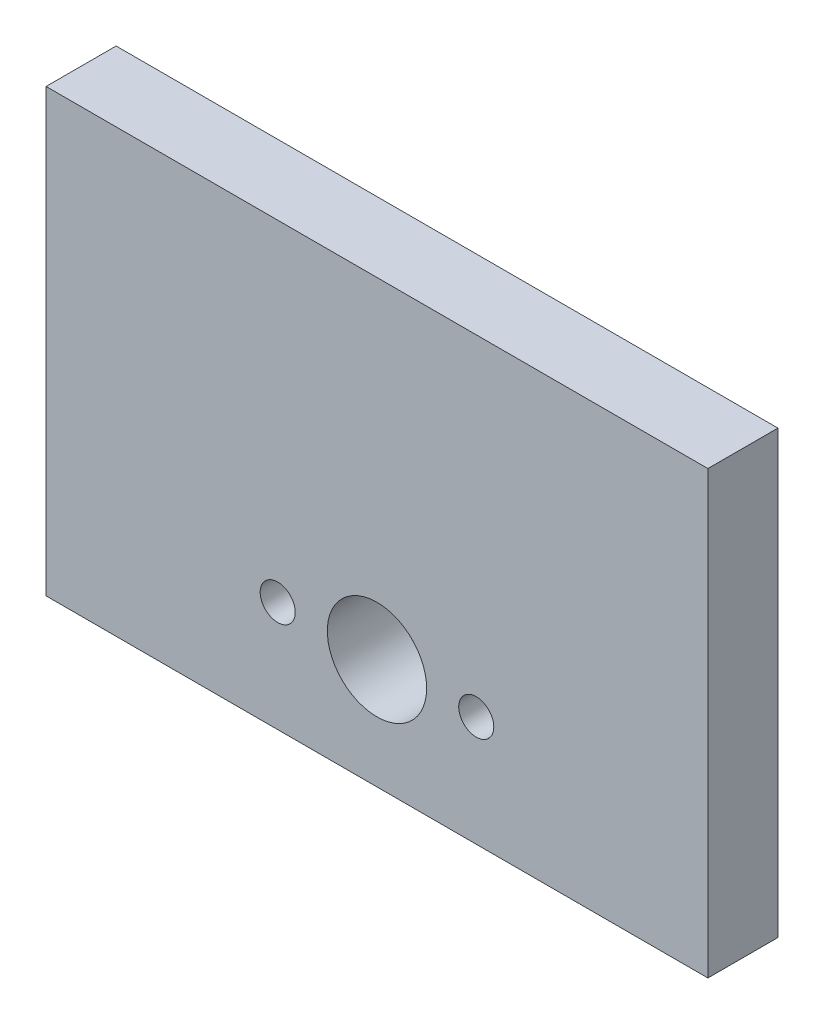
ISO-10303-21;
HEADER;
FILE_DESCRIPTION(('STEP AP214'),'2;1');
FILE_NAME('part.step','',(''),(''),'','','');
FILE_SCHEMA(('AUTOMOTIVE_DESIGN { 1 0 10303 214 1 1 1 1 }'));
ENDSEC;
DATA;
#1=APPLICATION_CONTEXT('core data for automotive mechanical design processes');
#2=APPLICATION_PROTOCOL_DEFINITION('international standard','automotive_design',2000,#1);
#3=PRODUCT_CONTEXT('',#1,'mechanical');
#4=PRODUCT('Part','Part','',(#3));
#5=PRODUCT_RELATED_PRODUCT_CATEGORY('part','',(#4));
#6=PRODUCT_DEFINITION_FORMATION('','',#4);
#7=PRODUCT_DEFINITION_CONTEXT('part definition',#1,'design');
#8=PRODUCT_DEFINITION('design','',#6,#7);
#9=PRODUCT_DEFINITION_SHAPE('','',#8);
#10=(LENGTH_UNIT() NAMED_UNIT(*) SI_UNIT(.MILLI.,.METRE.));
#11=(NAMED_UNIT(*) PLANE_ANGLE_UNIT() SI_UNIT($,.RADIAN.));
#12=(NAMED_UNIT(*) SI_UNIT($,.STERADIAN.) SOLID_ANGLE_UNIT());
#13=UNCERTAINTY_MEASURE_WITH_UNIT(LENGTH_MEASURE(1.E-05),#10,'distance_accuracy_value','');
#14=(GEOMETRIC_REPRESENTATION_CONTEXT(3) GLOBAL_UNCERTAINTY_ASSIGNED_CONTEXT((#13)) GLOBAL_UNIT_ASSIGNED_CONTEXT((#10,
#11,#12)) REPRESENTATION_CONTEXT('',''));
#15=CARTESIAN_POINT('',(0.,0.,0.));
#16=DIRECTION('',(0.,0.,1.));
#17=DIRECTION('',(1.,0.,0.));
#18=AXIS2_PLACEMENT_3D('',#15,#16,#17);
#19=CARTESIAN_POINT('',(60.,0.,6.35));
#20=DIRECTION('',(1.,0.,0.));
#21=DIRECTION('',(0.,1.,0.));
#22=AXIS2_PLACEMENT_3D('',#19,#20,#21);
#23=PLANE('',#22);
#24=DIRECTION('',(0.,-1.,0.));
#25=VECTOR('',#24,1.);
#26=CARTESIAN_POINT('',(60.,0.,0.));
#27=LINE('',#26,#25);
#28=CARTESIAN_POINT('',(60.,0.,0.));
#29=VERTEX_POINT('',#28);
#30=CARTESIAN_POINT('',(60.,-40.,0.));
#31=VERTEX_POINT('',#30);
#32=EDGE_CURVE('E125',#29,#31,#27,.T.);
#33=ORIENTED_EDGE('',*,*,#32,.F.);
#34=DIRECTION('',(0.,0.,-1.));
#35=VECTOR('',#34,1.);
#36=CARTESIAN_POINT('',(60.,0.,6.35));
#37=LINE('',#36,#35);
#38=CARTESIAN_POINT('',(60.,0.,6.35));
#39=VERTEX_POINT('',#38);
#40=EDGE_CURVE('E11',#39,#29,#37,.T.);
#41=ORIENTED_EDGE('',*,*,#40,.F.);
#42=DIRECTION('',(0.,-1.,0.));
#43=VECTOR('',#42,1.);
#44=CARTESIAN_POINT('',(60.,0.,6.35));
#45=LINE('',#44,#43);
#46=CARTESIAN_POINT('',(60.,-40.,6.35));
#47=VERTEX_POINT('',#46);
#48=EDGE_CURVE('E104',#39,#47,#45,.T.);
#49=ORIENTED_EDGE('',*,*,#48,.T.);
#50=DIRECTION('',(0.,0.,-1.));
#51=VECTOR('',#50,1.);
#52=CARTESIAN_POINT('',(60.,-40.,6.35));
#53=LINE('',#52,#51);
#54=EDGE_CURVE('E82',#47,#31,#53,.T.);
#55=ORIENTED_EDGE('',*,*,#54,.T.);
#56=EDGE_LOOP('',(#33,#41,#49,#55));
#57=FACE_BOUND('',#56,.T.);
#58=ADVANCED_FACE('F43',(#57),#23,.T.);
#59=CARTESIAN_POINT('',(0.,0.,6.35));
#60=DIRECTION('',(0.,1.,0.));
#61=DIRECTION('',(0.,0.,1.));
#62=AXIS2_PLACEMENT_3D('',#59,#60,#61);
#63=PLANE('',#62);
#64=DIRECTION('',(1.,0.,0.));
#65=VECTOR('',#64,1.);
#66=CARTESIAN_POINT('',(0.,0.,0.));
#67=LINE('',#66,#65);
#68=CARTESIAN_POINT('',(0.,0.,0.));
#69=VERTEX_POINT('',#68);
#70=EDGE_CURVE('E95',#69,#29,#67,.T.);
#71=ORIENTED_EDGE('',*,*,#70,.F.);
#72=DIRECTION('',(0.,0.,-1.));
#73=VECTOR('',#72,1.);
#74=CARTESIAN_POINT('',(0.,0.,6.35));
#75=LINE('',#74,#73);
#76=CARTESIAN_POINT('',(0.,0.,6.35));
#77=VERTEX_POINT('',#76);
#78=EDGE_CURVE('E52',#77,#69,#75,.T.);
#79=ORIENTED_EDGE('',*,*,#78,.F.);
#80=DIRECTION('',(1.,0.,0.));
#81=VECTOR('',#80,1.);
#82=CARTESIAN_POINT('',(0.,0.,6.35));
#83=LINE('',#82,#81);
#84=EDGE_CURVE('E93',#77,#39,#83,.T.);
#85=ORIENTED_EDGE('',*,*,#84,.T.);
#86=ORIENTED_EDGE('',*,*,#40,.T.);
#87=EDGE_LOOP('',(#71,#79,#85,#86));
#88=FACE_BOUND('',#87,.T.);
#89=ADVANCED_FACE('F91',(#88),#63,.T.);
#90=CARTESIAN_POINT('',(0.,0.,6.35));
#91=DIRECTION('',(1.,0.,0.));
#92=DIRECTION('',(0.,1.,0.));
#93=AXIS2_PLACEMENT_3D('',#90,#91,#92);
#94=PLANE('',#93);
#95=DIRECTION('',(0.,-1.,0.));
#96=VECTOR('',#95,1.);
#97=CARTESIAN_POINT('',(0.,0.,0.));
#98=LINE('',#97,#96);
#99=CARTESIAN_POINT('',(0.,-40.,0.));
#100=VERTEX_POINT('',#99);
#101=EDGE_CURVE('E75',#69,#100,#98,.T.);
#102=ORIENTED_EDGE('',*,*,#101,.T.);
#103=DIRECTION('',(0.,0.,-1.));
#104=VECTOR('',#103,1.);
#105=CARTESIAN_POINT('',(0.,-40.,6.35));
#106=LINE('',#105,#104);
#107=CARTESIAN_POINT('',(0.,-40.,6.35));
#108=VERTEX_POINT('',#107);
#109=EDGE_CURVE('E97',#108,#100,#106,.T.);
#110=ORIENTED_EDGE('',*,*,#109,.F.);
#111=DIRECTION('',(0.,-1.,0.));
#112=VECTOR('',#111,1.);
#113=CARTESIAN_POINT('',(0.,0.,6.35));
#114=LINE('',#113,#112);
#115=EDGE_CURVE('E98',#77,#108,#114,.T.);
#116=ORIENTED_EDGE('',*,*,#115,.F.);
#117=ORIENTED_EDGE('',*,*,#78,.T.);
#118=EDGE_LOOP('',(#102,#110,#116,#117));
#119=FACE_BOUND('',#118,.T.);
#120=ADVANCED_FACE('F99',(#119),#94,.F.);
#121=CARTESIAN_POINT('',(21.,-30.,6.35));
#122=DIRECTION('',(0.,0.,-1.));
#123=DIRECTION('',(-1.,0.,0.));
#124=AXIS2_PLACEMENT_3D('',#121,#122,#123);
#125=CYLINDRICAL_SURFACE('',#124,1.59);
#126=CARTESIAN_POINT('',(21.,-30.,6.35));
#127=DIRECTION('',(0.,0.,1.));
#128=DIRECTION('',(1.,0.,0.));
#129=AXIS2_PLACEMENT_3D('',#126,#127,#128);
#130=CIRCLE('',#129,1.59);
#131=CARTESIAN_POINT('',(22.59,-30.,6.35));
#132=VERTEX_POINT('',#131);
#133=EDGE_CURVE('E117',#132,#132,#130,.T.);
#134=ORIENTED_EDGE('',*,*,#133,.T.);
#135=EDGE_LOOP('',(#134));
#136=FACE_BOUND('',#135,.T.);
#137=CARTESIAN_POINT('',(21.,-30.,0.));
#138=DIRECTION('',(0.,0.,1.));
#139=DIRECTION('',(1.,0.,0.));
#140=AXIS2_PLACEMENT_3D('',#137,#138,#139);
#141=CIRCLE('',#140,1.59);
#142=CARTESIAN_POINT('',(22.59,-30.,0.));
#143=VERTEX_POINT('',#142);
#144=EDGE_CURVE('E140',#143,#143,#141,.T.);
#145=ORIENTED_EDGE('',*,*,#144,.F.);
#146=EDGE_LOOP('',(#145));
#147=FACE_BOUND('',#146,.T.);
#148=ADVANCED_FACE('F163',(#136,#147),#125,.F.);
#149=CARTESIAN_POINT('',(39.,-30.,6.35));
#150=DIRECTION('',(0.,0.,-1.));
#151=DIRECTION('',(-1.,0.,0.));
#152=AXIS2_PLACEMENT_3D('',#149,#150,#151);
#153=CYLINDRICAL_SURFACE('',#152,1.59);
#154=CARTESIAN_POINT('',(39.,-30.,6.35));
#155=DIRECTION('',(0.,0.,1.));
#156=DIRECTION('',(1.,0.,0.));
#157=AXIS2_PLACEMENT_3D('',#154,#155,#156);
#158=CIRCLE('',#157,1.59);
#159=CARTESIAN_POINT('',(40.59,-30.,6.35));
#160=VERTEX_POINT('',#159);
#161=EDGE_CURVE('E113',#160,#160,#158,.T.);
#162=ORIENTED_EDGE('',*,*,#161,.T.);
#163=EDGE_LOOP('',(#162));
#164=FACE_BOUND('',#163,.T.);
#165=CARTESIAN_POINT('',(39.,-30.,0.));
#166=DIRECTION('',(0.,0.,1.));
#167=DIRECTION('',(1.,0.,0.));
#168=AXIS2_PLACEMENT_3D('',#165,#166,#167);
#169=CIRCLE('',#168,1.59);
#170=CARTESIAN_POINT('',(40.59,-30.,0.));
#171=VERTEX_POINT('',#170);
#172=EDGE_CURVE('E136',#171,#171,#169,.T.);
#173=ORIENTED_EDGE('',*,*,#172,.F.);
#174=EDGE_LOOP('',(#173));
#175=FACE_BOUND('',#174,.T.);
#176=ADVANCED_FACE('F169',(#164,#175),#153,.F.);
#177=CARTESIAN_POINT('',(0.,-40.,6.35));
#178=DIRECTION('',(0.,1.,0.));
#179=DIRECTION('',(0.,0.,1.));
#180=AXIS2_PLACEMENT_3D('',#177,#178,#179);
#181=PLANE('',#180);
#182=DIRECTION('',(1.,0.,0.));
#183=VECTOR('',#182,1.);
#184=CARTESIAN_POINT('',(0.,-40.,0.));
#185=LINE('',#184,#183);
#186=EDGE_CURVE('E133',#100,#31,#185,.T.);
#187=ORIENTED_EDGE('',*,*,#186,.T.);
#188=ORIENTED_EDGE('',*,*,#54,.F.);
#189=DIRECTION('',(1.,0.,0.));
#190=VECTOR('',#189,1.);
#191=CARTESIAN_POINT('',(0.,-40.,6.35));
#192=LINE('',#191,#190);
#193=EDGE_CURVE('E60',#108,#47,#192,.T.);
#194=ORIENTED_EDGE('',*,*,#193,.F.);
#195=ORIENTED_EDGE('',*,*,#109,.T.);
#196=EDGE_LOOP('',(#187,#188,#194,#195));
#197=FACE_BOUND('',#196,.T.);
#198=ADVANCED_FACE('F152',(#197),#181,.F.);
#199=CARTESIAN_POINT('',(30.,-30.,6.35));
#200=DIRECTION('',(0.,0.,-1.));
#201=DIRECTION('',(-1.,0.,0.));
#202=AXIS2_PLACEMENT_3D('',#199,#200,#201);
#203=CYLINDRICAL_SURFACE('',#202,4.50000000000002);
#204=CARTESIAN_POINT('',(30.,-30.,6.35));
#205=DIRECTION('',(0.,0.,1.));
#206=DIRECTION('',(1.,0.,0.));
#207=AXIS2_PLACEMENT_3D('',#204,#205,#206);
#208=CIRCLE('',#207,4.50000000000002);
#209=CARTESIAN_POINT('',(34.5,-30.,6.35));
#210=VERTEX_POINT('',#209);
#211=EDGE_CURVE('E121',#210,#210,#208,.T.);
#212=ORIENTED_EDGE('',*,*,#211,.T.);
#213=EDGE_LOOP('',(#212));
#214=FACE_BOUND('',#213,.T.);
#215=CARTESIAN_POINT('',(30.,-30.,0.));
#216=DIRECTION('',(0.,0.,1.));
#217=DIRECTION('',(1.,0.,0.));
#218=AXIS2_PLACEMENT_3D('',#215,#216,#217);
#219=CIRCLE('',#218,4.50000000000002);
#220=CARTESIAN_POINT('',(34.5,-30.,0.));
#221=VERTEX_POINT('',#220);
#222=EDGE_CURVE('E108',#221,#221,#219,.T.);
#223=ORIENTED_EDGE('',*,*,#222,.F.);
#224=EDGE_LOOP('',(#223));
#225=FACE_BOUND('',#224,.T.);
#226=ADVANCED_FACE('F168',(#214,#225),#203,.F.);
#227=CARTESIAN_POINT('',(0.,0.,6.35));
#228=DIRECTION('',(0.,0.,1.));
#229=DIRECTION('',(1.,0.,0.));
#230=AXIS2_PLACEMENT_3D('',#227,#228,#229);
#231=PLANE('',#230);
#232=ORIENTED_EDGE('',*,*,#48,.F.);
#233=ORIENTED_EDGE('',*,*,#84,.F.);
#234=ORIENTED_EDGE('',*,*,#115,.T.);
#235=ORIENTED_EDGE('',*,*,#193,.T.);
#236=EDGE_LOOP('',(#232,#233,#234,#235));
#237=FACE_BOUND('',#236,.T.);
#238=ORIENTED_EDGE('',*,*,#161,.F.);
#239=EDGE_LOOP('',(#238));
#240=FACE_BOUND('',#239,.T.);
#241=ORIENTED_EDGE('',*,*,#133,.F.);
#242=EDGE_LOOP('',(#241));
#243=FACE_BOUND('',#242,.T.);
#244=ORIENTED_EDGE('',*,*,#211,.F.);
#245=EDGE_LOOP('',(#244));
#246=FACE_BOUND('',#245,.T.);
#247=ADVANCED_FACE('F102',(#237,#240,#243,#246),#231,.T.);
#248=CARTESIAN_POINT('',(0.,0.,0.));
#249=DIRECTION('',(0.,0.,1.));
#250=DIRECTION('',(1.,0.,0.));
#251=AXIS2_PLACEMENT_3D('',#248,#249,#250);
#252=PLANE('',#251);
#253=ORIENTED_EDGE('',*,*,#32,.T.);
#254=ORIENTED_EDGE('',*,*,#186,.F.);
#255=ORIENTED_EDGE('',*,*,#101,.F.);
#256=ORIENTED_EDGE('',*,*,#70,.T.);
#257=EDGE_LOOP('',(#253,#254,#255,#256));
#258=FACE_BOUND('',#257,.T.);
#259=ORIENTED_EDGE('',*,*,#172,.T.);
#260=EDGE_LOOP('',(#259));
#261=FACE_BOUND('',#260,.T.);
#262=ORIENTED_EDGE('',*,*,#144,.T.);
#263=EDGE_LOOP('',(#262));
#264=FACE_BOUND('',#263,.T.);
#265=ORIENTED_EDGE('',*,*,#222,.T.);
#266=EDGE_LOOP('',(#265));
#267=FACE_BOUND('',#266,.T.);
#268=ADVANCED_FACE('F154',(#258,#261,#264,#267),#252,.F.);
#269=CLOSED_SHELL('',(#58,#89,#120,#148,#176,#198,#226,#247,#268));
#270=MANIFOLD_SOLID_BREP('B2',#269);
#271=ADVANCED_BREP_SHAPE_REPRESENTATION('',(#18,#270),#14);
#272=SHAPE_DEFINITION_REPRESENTATION(#9,#271);
ENDSEC;
END-ISO-10303-21;
